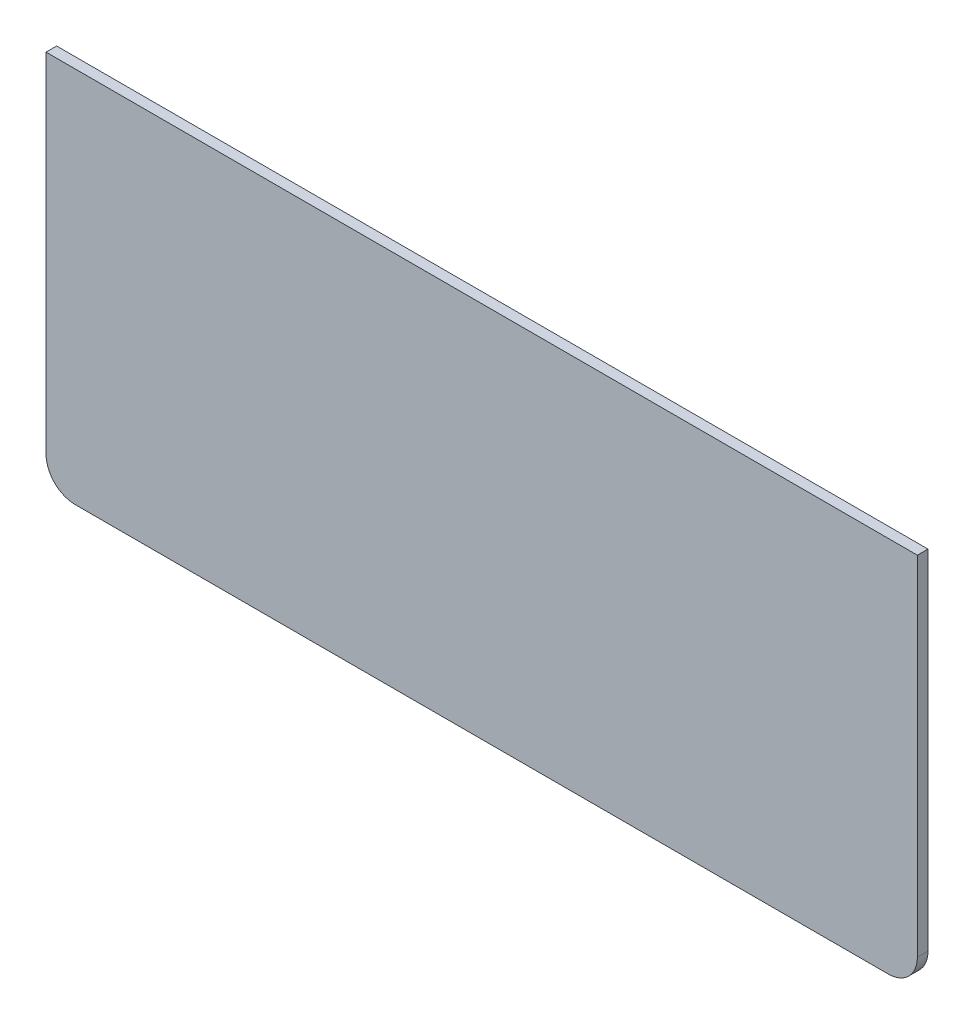
ISO-10303-21;
HEADER;
FILE_DESCRIPTION(('STEP AP214'),'2;1');
FILE_NAME('part.step','',(''),(''),'','','');
FILE_SCHEMA(('AUTOMOTIVE_DESIGN { 1 0 10303 214 1 1 1 1 }'));
ENDSEC;
DATA;
#1=APPLICATION_CONTEXT('core data for automotive mechanical design processes');
#2=APPLICATION_PROTOCOL_DEFINITION('international standard','automotive_design',2000,#1);
#3=PRODUCT_CONTEXT('',#1,'mechanical');
#4=PRODUCT('Part','Part','',(#3));
#5=PRODUCT_RELATED_PRODUCT_CATEGORY('part','',(#4));
#6=PRODUCT_DEFINITION_FORMATION('','',#4);
#7=PRODUCT_DEFINITION_CONTEXT('part definition',#1,'design');
#8=PRODUCT_DEFINITION('design','',#6,#7);
#9=PRODUCT_DEFINITION_SHAPE('','',#8);
#10=(LENGTH_UNIT() NAMED_UNIT(*) SI_UNIT(.MILLI.,.METRE.));
#11=(NAMED_UNIT(*) PLANE_ANGLE_UNIT() SI_UNIT($,.RADIAN.));
#12=(NAMED_UNIT(*) SI_UNIT($,.STERADIAN.) SOLID_ANGLE_UNIT());
#13=UNCERTAINTY_MEASURE_WITH_UNIT(LENGTH_MEASURE(1.E-05),#10,'distance_accuracy_value','');
#14=(GEOMETRIC_REPRESENTATION_CONTEXT(3) GLOBAL_UNCERTAINTY_ASSIGNED_CONTEXT((#13)) GLOBAL_UNIT_ASSIGNED_CONTEXT((#10,
#11,#12)) REPRESENTATION_CONTEXT('',''));
#15=CARTESIAN_POINT('',(0.,0.,0.));
#16=DIRECTION('',(0.,0.,1.));
#17=DIRECTION('',(1.,0.,0.));
#18=AXIS2_PLACEMENT_3D('',#15,#16,#17);
#19=CARTESIAN_POINT('',(-53.5866028445359,-72.6394712225838,3.17499999999998));
#20=DIRECTION('',(1.,0.,0.));
#21=DIRECTION('',(0.,0.,-1.));
#22=AXIS2_PLACEMENT_3D('',#19,#20,#21);
#23=PLANE('',#22);
#24=DIRECTION('',(0.,-1.,0.));
#25=VECTOR('',#24,1.);
#26=CARTESIAN_POINT('',(-53.5866028445359,-72.6394712225838,0.));
#27=LINE('',#26,#25);
#28=CARTESIAN_POINT('',(-53.5866028445359,40.5355287774162,0.));
#29=VERTEX_POINT('',#28);
#30=CARTESIAN_POINT('',(-53.5866028445359,-63.9082212225838,0.));
#31=VERTEX_POINT('',#30);
#32=EDGE_CURVE('E112',#29,#31,#27,.T.);
#33=ORIENTED_EDGE('',*,*,#32,.T.);
#34=DIRECTION('',(0.,0.,-1.));
#35=VECTOR('',#34,1.);
#36=CARTESIAN_POINT('',(-53.5866028445359,-63.9082212225838,3.17499999999998));
#37=LINE('',#36,#35);
#38=CARTESIAN_POINT('',(-53.5866028445359,-63.9082212225838,3.17499999999998));
#39=VERTEX_POINT('',#38);
#40=EDGE_CURVE('E56',#31,#39,#37,.F.);
#41=ORIENTED_EDGE('',*,*,#40,.T.);
#42=DIRECTION('',(0.,-1.,0.));
#43=VECTOR('',#42,1.);
#44=CARTESIAN_POINT('',(-53.5866028445359,-72.6394712225838,3.17499999999998));
#45=LINE('',#44,#43);
#46=CARTESIAN_POINT('',(-53.5866028445359,40.5355287774162,3.17499999999998));
#47=VERTEX_POINT('',#46);
#48=EDGE_CURVE('E119',#47,#39,#45,.T.);
#49=ORIENTED_EDGE('',*,*,#48,.F.);
#50=DIRECTION('',(0.,0.,-1.));
#51=VECTOR('',#50,1.);
#52=CARTESIAN_POINT('',(-53.5866028445359,40.5355287774162,3.17499999999998));
#53=LINE('',#52,#51);
#54=EDGE_CURVE('E104',#47,#29,#53,.T.);
#55=ORIENTED_EDGE('',*,*,#54,.T.);
#56=EDGE_LOOP('',(#33,#41,#49,#55));
#57=FACE_BOUND('',#56,.T.);
#58=ADVANCED_FACE('F33',(#57),#23,.F.);
#59=CARTESIAN_POINT('',(207.763397155464,-72.6394712225837,3.17499999999998));
#60=DIRECTION('',(0.,1.,0.));
#61=DIRECTION('',(-1.,0.,0.));
#62=AXIS2_PLACEMENT_3D('',#59,#60,#61);
#63=PLANE('',#62);
#64=DIRECTION('',(1.,0.,0.));
#65=VECTOR('',#64,1.);
#66=CARTESIAN_POINT('',(207.763397155464,-72.6394712225837,3.17499999999998));
#67=LINE('',#66,#65);
#68=CARTESIAN_POINT('',(-44.8553528445359,-72.6394712225838,3.17499999999998));
#69=VERTEX_POINT('',#68);
#70=CARTESIAN_POINT('',(199.032147155464,-72.6394712225837,3.17499999999998));
#71=VERTEX_POINT('',#70);
#72=EDGE_CURVE('E94',#69,#71,#67,.T.);
#73=ORIENTED_EDGE('',*,*,#72,.F.);
#74=DIRECTION('',(0.,0.,-1.));
#75=VECTOR('',#74,1.);
#76=CARTESIAN_POINT('',(-44.8553528445359,-72.6394712225838,3.17499999999998));
#77=LINE('',#76,#75);
#78=CARTESIAN_POINT('',(-44.8553528445359,-72.6394712225838,0.));
#79=VERTEX_POINT('',#78);
#80=EDGE_CURVE('E122',#69,#79,#77,.T.);
#81=ORIENTED_EDGE('',*,*,#80,.T.);
#82=DIRECTION('',(1.,0.,0.));
#83=VECTOR('',#82,1.);
#84=CARTESIAN_POINT('',(207.763397155464,-72.6394712225837,0.));
#85=LINE('',#84,#83);
#86=CARTESIAN_POINT('',(199.032147155464,-72.6394712225837,0.));
#87=VERTEX_POINT('',#86);
#88=EDGE_CURVE('E114',#79,#87,#85,.T.);
#89=ORIENTED_EDGE('',*,*,#88,.T.);
#90=DIRECTION('',(0.,0.,-1.));
#91=VECTOR('',#90,1.);
#92=CARTESIAN_POINT('',(199.032147155464,-72.6394712225837,3.17499999999998));
#93=LINE('',#92,#91);
#94=EDGE_CURVE('E103',#87,#71,#93,.F.);
#95=ORIENTED_EDGE('',*,*,#94,.T.);
#96=EDGE_LOOP('',(#73,#81,#89,#95));
#97=FACE_BOUND('',#96,.T.);
#98=ADVANCED_FACE('F135',(#97),#63,.F.);
#99=CARTESIAN_POINT('',(207.763397155464,40.5355287774162,3.17499999999998));
#100=DIRECTION('',(-1.,0.,0.));
#101=DIRECTION('',(0.,0.,1.));
#102=AXIS2_PLACEMENT_3D('',#99,#100,#101);
#103=PLANE('',#102);
#104=DIRECTION('',(0.,1.,0.));
#105=VECTOR('',#104,1.);
#106=CARTESIAN_POINT('',(207.763397155464,40.5355287774162,3.17499999999998));
#107=LINE('',#106,#105);
#108=CARTESIAN_POINT('',(207.763397155464,-63.9082212225837,3.17499999999998));
#109=VERTEX_POINT('',#108);
#110=CARTESIAN_POINT('',(207.763397155464,40.5355287774162,3.17499999999998));
#111=VERTEX_POINT('',#110);
#112=EDGE_CURVE('E86',#109,#111,#107,.T.);
#113=ORIENTED_EDGE('',*,*,#112,.F.);
#114=DIRECTION('',(0.,0.,-1.));
#115=VECTOR('',#114,1.);
#116=CARTESIAN_POINT('',(207.763397155464,-63.9082212225837,3.17499999999998));
#117=LINE('',#116,#115);
#118=CARTESIAN_POINT('',(207.763397155464,-63.9082212225837,0.));
#119=VERTEX_POINT('',#118);
#120=EDGE_CURVE('E11',#109,#119,#117,.T.);
#121=ORIENTED_EDGE('',*,*,#120,.T.);
#122=DIRECTION('',(0.,1.,0.));
#123=VECTOR('',#122,1.);
#124=CARTESIAN_POINT('',(207.763397155464,40.5355287774162,0.));
#125=LINE('',#124,#123);
#126=CARTESIAN_POINT('',(207.763397155464,40.5355287774162,0.));
#127=VERTEX_POINT('',#126);
#128=EDGE_CURVE('E100',#119,#127,#125,.T.);
#129=ORIENTED_EDGE('',*,*,#128,.T.);
#130=DIRECTION('',(0.,0.,-1.));
#131=VECTOR('',#130,1.);
#132=CARTESIAN_POINT('',(207.763397155464,40.5355287774162,3.17499999999998));
#133=LINE('',#132,#131);
#134=EDGE_CURVE('E97',#111,#127,#133,.T.);
#135=ORIENTED_EDGE('',*,*,#134,.F.);
#136=EDGE_LOOP('',(#113,#121,#129,#135));
#137=FACE_BOUND('',#136,.T.);
#138=ADVANCED_FACE('F98',(#137),#103,.F.);
#139=CARTESIAN_POINT('',(-53.5866028445359,40.5355287774162,3.17499999999998));
#140=DIRECTION('',(0.,-1.,0.));
#141=DIRECTION('',(0.,0.,-1.));
#142=AXIS2_PLACEMENT_3D('',#139,#140,#141);
#143=PLANE('',#142);
#144=DIRECTION('',(-1.,0.,0.));
#145=VECTOR('',#144,1.);
#146=CARTESIAN_POINT('',(-53.5866028445359,40.5355287774162,0.));
#147=LINE('',#146,#145);
#148=EDGE_CURVE('E118',#127,#29,#147,.T.);
#149=ORIENTED_EDGE('',*,*,#148,.T.);
#150=ORIENTED_EDGE('',*,*,#54,.F.);
#151=DIRECTION('',(-1.,0.,0.));
#152=VECTOR('',#151,1.);
#153=CARTESIAN_POINT('',(-53.5866028445359,40.5355287774162,3.17499999999998));
#154=LINE('',#153,#152);
#155=EDGE_CURVE('E90',#111,#47,#154,.T.);
#156=ORIENTED_EDGE('',*,*,#155,.F.);
#157=ORIENTED_EDGE('',*,*,#134,.T.);
#158=EDGE_LOOP('',(#149,#150,#156,#157));
#159=FACE_BOUND('',#158,.T.);
#160=ADVANCED_FACE('F106',(#159),#143,.F.);
#161=CARTESIAN_POINT('',(0.,0.,3.17499999999998));
#162=DIRECTION('',(0.,0.,-1.));
#163=DIRECTION('',(-1.,0.,0.));
#164=AXIS2_PLACEMENT_3D('',#161,#162,#163);
#165=PLANE('',#164);
#166=ORIENTED_EDGE('',*,*,#48,.T.);
#167=CARTESIAN_POINT('',(-44.8553528445359,-63.9082212225838,3.17499999999998));
#168=DIRECTION('',(0.,0.,-1.));
#169=DIRECTION('',(-1.,0.,0.));
#170=AXIS2_PLACEMENT_3D('',#167,#168,#169);
#171=CIRCLE('',#170,8.73125);
#172=EDGE_CURVE('E41',#39,#69,#171,.F.);
#173=ORIENTED_EDGE('',*,*,#172,.T.);
#174=ORIENTED_EDGE('',*,*,#72,.T.);
#175=CARTESIAN_POINT('',(199.032147155464,-63.9082212225837,3.17499999999998));
#176=DIRECTION('',(0.,0.,-1.));
#177=DIRECTION('',(-1.,0.,0.));
#178=AXIS2_PLACEMENT_3D('',#175,#176,#177);
#179=CIRCLE('',#178,8.73125);
#180=EDGE_CURVE('E48',#71,#109,#179,.F.);
#181=ORIENTED_EDGE('',*,*,#180,.T.);
#182=ORIENTED_EDGE('',*,*,#112,.T.);
#183=ORIENTED_EDGE('',*,*,#155,.T.);
#184=EDGE_LOOP('',(#166,#173,#174,#181,#182,#183));
#185=FACE_BOUND('',#184,.T.);
#186=ADVANCED_FACE('F88',(#185),#165,.F.);
#187=CARTESIAN_POINT('',(0.,0.,0.));
#188=DIRECTION('',(0.,0.,-1.));
#189=DIRECTION('',(-1.,0.,0.));
#190=AXIS2_PLACEMENT_3D('',#187,#188,#189);
#191=PLANE('',#190);
#192=ORIENTED_EDGE('',*,*,#88,.F.);
#193=CARTESIAN_POINT('',(-44.8553528445359,-63.9082212225838,0.));
#194=DIRECTION('',(0.,0.,-1.));
#195=DIRECTION('',(-1.,0.,0.));
#196=AXIS2_PLACEMENT_3D('',#193,#194,#195);
#197=CIRCLE('',#196,8.73125);
#198=EDGE_CURVE('E127',#79,#31,#197,.T.);
#199=ORIENTED_EDGE('',*,*,#198,.T.);
#200=ORIENTED_EDGE('',*,*,#32,.F.);
#201=ORIENTED_EDGE('',*,*,#148,.F.);
#202=ORIENTED_EDGE('',*,*,#128,.F.);
#203=CARTESIAN_POINT('',(199.032147155464,-63.9082212225837,0.));
#204=DIRECTION('',(0.,0.,-1.));
#205=DIRECTION('',(-1.,0.,0.));
#206=AXIS2_PLACEMENT_3D('',#203,#204,#205);
#207=CIRCLE('',#206,8.73125);
#208=EDGE_CURVE('E125',#119,#87,#207,.T.);
#209=ORIENTED_EDGE('',*,*,#208,.T.);
#210=EDGE_LOOP('',(#192,#199,#200,#201,#202,#209));
#211=FACE_BOUND('',#210,.T.);
#212=ADVANCED_FACE('F141',(#211),#191,.T.);
#213=CARTESIAN_POINT('',(-44.8553528445359,-63.9082212225838,3.17499999999998));
#214=DIRECTION('',(0.,0.,-1.));
#215=DIRECTION('',(-1.,0.,0.));
#216=AXIS2_PLACEMENT_3D('',#213,#214,#215);
#217=CYLINDRICAL_SURFACE('',#216,8.73125);
#218=ORIENTED_EDGE('',*,*,#172,.F.);
#219=ORIENTED_EDGE('',*,*,#40,.F.);
#220=ORIENTED_EDGE('',*,*,#198,.F.);
#221=ORIENTED_EDGE('',*,*,#80,.F.);
#222=EDGE_LOOP('',(#218,#219,#220,#221));
#223=FACE_BOUND('',#222,.T.);
#224=ADVANCED_FACE('F138',(#223),#217,.T.);
#225=CARTESIAN_POINT('',(199.032147155464,-63.9082212225837,3.17499999999998));
#226=DIRECTION('',(0.,0.,-1.));
#227=DIRECTION('',(-1.,0.,0.));
#228=AXIS2_PLACEMENT_3D('',#225,#226,#227);
#229=CYLINDRICAL_SURFACE('',#228,8.73125);
#230=ORIENTED_EDGE('',*,*,#180,.F.);
#231=ORIENTED_EDGE('',*,*,#94,.F.);
#232=ORIENTED_EDGE('',*,*,#208,.F.);
#233=ORIENTED_EDGE('',*,*,#120,.F.);
#234=EDGE_LOOP('',(#230,#231,#232,#233));
#235=FACE_BOUND('',#234,.T.);
#236=ADVANCED_FACE('F35',(#235),#229,.T.);
#237=CLOSED_SHELL('',(#58,#98,#138,#160,#186,#212,#224,#236));
#238=MANIFOLD_SOLID_BREP('B2',#237);
#239=ADVANCED_BREP_SHAPE_REPRESENTATION('',(#18,#238),#14);
#240=SHAPE_DEFINITION_REPRESENTATION(#9,#239);
ENDSEC;
END-ISO-10303-21;
